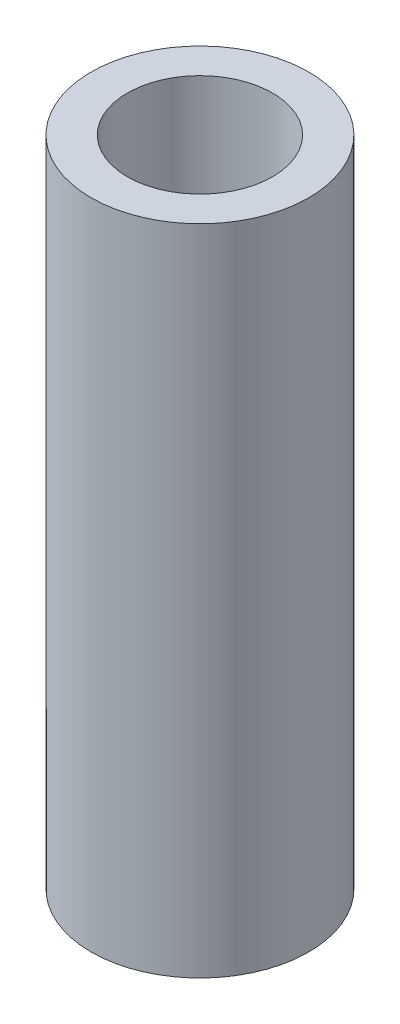
ISO-10303-21;
HEADER;
FILE_DESCRIPTION(('STEP AP214'),'2;1');
FILE_NAME('part.step','',(''),(''),'','','');
FILE_SCHEMA(('AUTOMOTIVE_DESIGN { 1 0 10303 214 1 1 1 1 }'));
ENDSEC;
DATA;
#1=APPLICATION_CONTEXT('core data for automotive mechanical design processes');
#2=APPLICATION_PROTOCOL_DEFINITION('international standard','automotive_design',2000,#1);
#3=PRODUCT_CONTEXT('',#1,'mechanical');
#4=PRODUCT('Part','Part','',(#3));
#5=PRODUCT_RELATED_PRODUCT_CATEGORY('part','',(#4));
#6=PRODUCT_DEFINITION_FORMATION('','',#4);
#7=PRODUCT_DEFINITION_CONTEXT('part definition',#1,'design');
#8=PRODUCT_DEFINITION('design','',#6,#7);
#9=PRODUCT_DEFINITION_SHAPE('','',#8);
#10=(LENGTH_UNIT() NAMED_UNIT(*) SI_UNIT(.MILLI.,.METRE.));
#11=(NAMED_UNIT(*) PLANE_ANGLE_UNIT() SI_UNIT($,.RADIAN.));
#12=(NAMED_UNIT(*) SI_UNIT($,.STERADIAN.) SOLID_ANGLE_UNIT());
#13=UNCERTAINTY_MEASURE_WITH_UNIT(LENGTH_MEASURE(1.E-05),#10,'distance_accuracy_value','');
#14=(GEOMETRIC_REPRESENTATION_CONTEXT(3) GLOBAL_UNCERTAINTY_ASSIGNED_CONTEXT((#13)) GLOBAL_UNIT_ASSIGNED_CONTEXT((#10,
#11,#12)) REPRESENTATION_CONTEXT('',''));
#15=CARTESIAN_POINT('',(0.,0.,0.));
#16=DIRECTION('',(0.,0.,1.));
#17=DIRECTION('',(1.,0.,0.));
#18=AXIS2_PLACEMENT_3D('',#15,#16,#17);
#19=CARTESIAN_POINT('',(0.,18.,0.));
#20=DIRECTION('',(0.,1.,0.));
#21=DIRECTION('',(0.,0.,1.));
#22=AXIS2_PLACEMENT_3D('',#19,#20,#21);
#23=PLANE('',#22);
#24=CARTESIAN_POINT('',(0.,18.,0.));
#25=DIRECTION('',(0.,1.,0.));
#26=DIRECTION('',(0.,0.,1.));
#27=AXIS2_PLACEMENT_3D('',#24,#25,#26);
#28=CIRCLE('',#27,3.);
#29=CARTESIAN_POINT('',(0.,18.,3.));
#30=VERTEX_POINT('',#29);
#31=EDGE_CURVE('E10',#30,#30,#28,.T.);
#32=ORIENTED_EDGE('',*,*,#31,.T.);
#33=EDGE_LOOP('',(#32));
#34=FACE_BOUND('',#33,.T.);
#35=CARTESIAN_POINT('',(0.,18.,0.));
#36=DIRECTION('',(0.,1.,0.));
#37=DIRECTION('',(0.,0.,1.));
#38=AXIS2_PLACEMENT_3D('',#35,#36,#37);
#39=CIRCLE('',#38,2.);
#40=CARTESIAN_POINT('',(0.,18.,2.));
#41=VERTEX_POINT('',#40);
#42=EDGE_CURVE('E43',#41,#41,#39,.T.);
#43=ORIENTED_EDGE('',*,*,#42,.F.);
#44=EDGE_LOOP('',(#43));
#45=FACE_BOUND('',#44,.T.);
#46=ADVANCED_FACE('F32',(#34,#45),#23,.T.);
#47=CARTESIAN_POINT('',(0.,0.,0.));
#48=DIRECTION('',(0.,1.,0.));
#49=DIRECTION('',(0.,0.,1.));
#50=AXIS2_PLACEMENT_3D('',#47,#48,#49);
#51=PLANE('',#50);
#52=CARTESIAN_POINT('',(0.,0.,0.));
#53=DIRECTION('',(0.,1.,0.));
#54=DIRECTION('',(0.,0.,1.));
#55=AXIS2_PLACEMENT_3D('',#52,#53,#54);
#56=CIRCLE('',#55,3.);
#57=CARTESIAN_POINT('',(0.,0.,3.));
#58=VERTEX_POINT('',#57);
#59=EDGE_CURVE('E36',#58,#58,#56,.T.);
#60=ORIENTED_EDGE('',*,*,#59,.F.);
#61=EDGE_LOOP('',(#60));
#62=FACE_BOUND('',#61,.T.);
#63=CARTESIAN_POINT('',(0.,0.,0.));
#64=DIRECTION('',(0.,1.,0.));
#65=DIRECTION('',(0.,0.,1.));
#66=AXIS2_PLACEMENT_3D('',#63,#64,#65);
#67=CIRCLE('',#66,2.);
#68=CARTESIAN_POINT('',(0.,0.,2.));
#69=VERTEX_POINT('',#68);
#70=EDGE_CURVE('E45',#69,#69,#67,.T.);
#71=ORIENTED_EDGE('',*,*,#70,.T.);
#72=EDGE_LOOP('',(#71));
#73=FACE_BOUND('',#72,.T.);
#74=ADVANCED_FACE('F55',(#62,#73),#51,.F.);
#75=CARTESIAN_POINT('',(0.,18.,0.));
#76=DIRECTION('',(0.,-1.,0.));
#77=DIRECTION('',(0.,0.,-1.));
#78=AXIS2_PLACEMENT_3D('',#75,#76,#77);
#79=CYLINDRICAL_SURFACE('',#78,3.);
#80=ORIENTED_EDGE('',*,*,#31,.F.);
#81=EDGE_LOOP('',(#80));
#82=FACE_BOUND('',#81,.T.);
#83=ORIENTED_EDGE('',*,*,#59,.T.);
#84=EDGE_LOOP('',(#83));
#85=FACE_BOUND('',#84,.T.);
#86=ADVANCED_FACE('F34',(#82,#85),#79,.T.);
#87=CARTESIAN_POINT('',(0.,18.,0.));
#88=DIRECTION('',(0.,-1.,0.));
#89=DIRECTION('',(0.,0.,-1.));
#90=AXIS2_PLACEMENT_3D('',#87,#88,#89);
#91=CYLINDRICAL_SURFACE('',#90,2.);
#92=ORIENTED_EDGE('',*,*,#42,.T.);
#93=EDGE_LOOP('',(#92));
#94=FACE_BOUND('',#93,.T.);
#95=ORIENTED_EDGE('',*,*,#70,.F.);
#96=EDGE_LOOP('',(#95));
#97=FACE_BOUND('',#96,.T.);
#98=ADVANCED_FACE('F51',(#94,#97),#91,.F.);
#99=CLOSED_SHELL('',(#46,#74,#86,#98));
#100=MANIFOLD_SOLID_BREP('B2',#99);
#101=ADVANCED_BREP_SHAPE_REPRESENTATION('',(#18,#100),#14);
#102=SHAPE_DEFINITION_REPRESENTATION(#9,#101);
ENDSEC;
END-ISO-10303-21;
